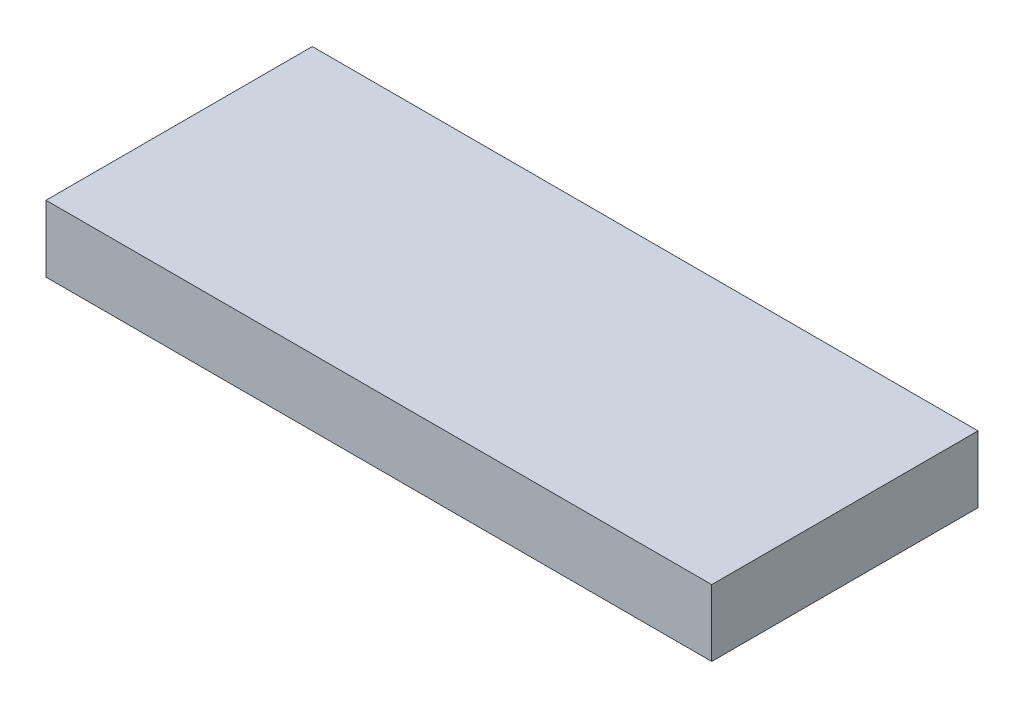
ISO-10303-21;
HEADER;
FILE_DESCRIPTION(('STEP AP214'),'2;1');
FILE_NAME('part.step','',(''),(''),'','','');
FILE_SCHEMA(('AUTOMOTIVE_DESIGN { 1 0 10303 214 1 1 1 1 }'));
ENDSEC;
DATA;
#1=APPLICATION_CONTEXT('core data for automotive mechanical design processes');
#2=APPLICATION_PROTOCOL_DEFINITION('international standard','automotive_design',2000,#1);
#3=PRODUCT_CONTEXT('',#1,'mechanical');
#4=PRODUCT('Part','Part','',(#3));
#5=PRODUCT_RELATED_PRODUCT_CATEGORY('part','',(#4));
#6=PRODUCT_DEFINITION_FORMATION('','',#4);
#7=PRODUCT_DEFINITION_CONTEXT('part definition',#1,'design');
#8=PRODUCT_DEFINITION('design','',#6,#7);
#9=PRODUCT_DEFINITION_SHAPE('','',#8);
#10=(LENGTH_UNIT() NAMED_UNIT(*) SI_UNIT(.MILLI.,.METRE.));
#11=(NAMED_UNIT(*) PLANE_ANGLE_UNIT() SI_UNIT($,.RADIAN.));
#12=(NAMED_UNIT(*) SI_UNIT($,.STERADIAN.) SOLID_ANGLE_UNIT());
#13=UNCERTAINTY_MEASURE_WITH_UNIT(LENGTH_MEASURE(1.E-05),#10,'distance_accuracy_value','');
#14=(GEOMETRIC_REPRESENTATION_CONTEXT(3) GLOBAL_UNCERTAINTY_ASSIGNED_CONTEXT((#13)) GLOBAL_UNIT_ASSIGNED_CONTEXT((#10,
#11,#12)) REPRESENTATION_CONTEXT('',''));
#15=CARTESIAN_POINT('',(0.,0.,0.));
#16=DIRECTION('',(0.,0.,1.));
#17=DIRECTION('',(1.,0.,0.));
#18=AXIS2_PLACEMENT_3D('',#15,#16,#17);
#19=CARTESIAN_POINT('',(152.4,25.4,50.8));
#20=DIRECTION('',(-1.,0.,0.));
#21=DIRECTION('',(0.,0.,1.));
#22=AXIS2_PLACEMENT_3D('',#19,#20,#21);
#23=PLANE('',#22);
#24=DIRECTION('',(0.,0.,-1.));
#25=VECTOR('',#24,1.);
#26=CARTESIAN_POINT('',(152.4,0.,50.8));
#27=LINE('',#26,#25);
#28=CARTESIAN_POINT('',(152.4,0.,50.8));
#29=VERTEX_POINT('',#28);
#30=CARTESIAN_POINT('',(152.4,0.,-50.8));
#31=VERTEX_POINT('',#30);
#32=EDGE_CURVE('E88',#29,#31,#27,.T.);
#33=ORIENTED_EDGE('',*,*,#32,.T.);
#34=DIRECTION('',(0.,-1.,0.));
#35=VECTOR('',#34,1.);
#36=CARTESIAN_POINT('',(152.4,25.4,-50.8));
#37=LINE('',#36,#35);
#38=CARTESIAN_POINT('',(152.4,25.4,-50.8));
#39=VERTEX_POINT('',#38);
#40=EDGE_CURVE('E11',#39,#31,#37,.T.);
#41=ORIENTED_EDGE('',*,*,#40,.F.);
#42=DIRECTION('',(0.,0.,-1.));
#43=VECTOR('',#42,1.);
#44=CARTESIAN_POINT('',(152.4,25.4,50.8));
#45=LINE('',#44,#43);
#46=CARTESIAN_POINT('',(152.4,25.4,50.8));
#47=VERTEX_POINT('',#46);
#48=EDGE_CURVE('E82',#47,#39,#45,.T.);
#49=ORIENTED_EDGE('',*,*,#48,.F.);
#50=DIRECTION('',(0.,-1.,0.));
#51=VECTOR('',#50,1.);
#52=CARTESIAN_POINT('',(152.4,25.4,50.8));
#53=LINE('',#52,#51);
#54=EDGE_CURVE('E43',#47,#29,#53,.T.);
#55=ORIENTED_EDGE('',*,*,#54,.T.);
#56=EDGE_LOOP('',(#33,#41,#49,#55));
#57=FACE_BOUND('',#56,.T.);
#58=ADVANCED_FACE('F36',(#57),#23,.F.);
#59=CARTESIAN_POINT('',(-152.4,25.4,-50.8));
#60=DIRECTION('',(0.,0.,1.));
#61=DIRECTION('',(1.,0.,0.));
#62=AXIS2_PLACEMENT_3D('',#59,#60,#61);
#63=PLANE('',#62);
#64=DIRECTION('',(-1.,0.,0.));
#65=VECTOR('',#64,1.);
#66=CARTESIAN_POINT('',(-152.4,0.,-50.8));
#67=LINE('',#66,#65);
#68=CARTESIAN_POINT('',(-101.6,0.,-50.8));
#69=VERTEX_POINT('',#68);
#70=EDGE_CURVE('E83',#31,#69,#67,.T.);
#71=ORIENTED_EDGE('',*,*,#70,.T.);
#72=DIRECTION('',(0.,1.,0.));
#73=VECTOR('',#72,1.);
#74=CARTESIAN_POINT('',(-101.6,-113.592253256989,-50.8));
#75=LINE('',#74,#73);
#76=CARTESIAN_POINT('',(-101.6,25.4,-50.8));
#77=VERTEX_POINT('',#76);
#78=EDGE_CURVE('E50',#69,#77,#75,.T.);
#79=ORIENTED_EDGE('',*,*,#78,.T.);
#80=DIRECTION('',(-1.,0.,0.));
#81=VECTOR('',#80,1.);
#82=CARTESIAN_POINT('',(-152.4,25.4,-50.8));
#83=LINE('',#82,#81);
#84=EDGE_CURVE('E97',#39,#77,#83,.T.);
#85=ORIENTED_EDGE('',*,*,#84,.F.);
#86=ORIENTED_EDGE('',*,*,#40,.T.);
#87=EDGE_LOOP('',(#71,#79,#85,#86));
#88=FACE_BOUND('',#87,.T.);
#89=ADVANCED_FACE('F108',(#88),#63,.F.);
#90=CARTESIAN_POINT('',(-152.4,25.4,50.8));
#91=DIRECTION('',(0.,0.,-1.));
#92=DIRECTION('',(-1.,0.,0.));
#93=AXIS2_PLACEMENT_3D('',#90,#91,#92);
#94=PLANE('',#93);
#95=DIRECTION('',(1.,0.,0.));
#96=VECTOR('',#95,1.);
#97=CARTESIAN_POINT('',(-152.4,25.4,50.8));
#98=LINE('',#97,#96);
#99=CARTESIAN_POINT('',(-101.6,25.4,50.8));
#100=VERTEX_POINT('',#99);
#101=EDGE_CURVE('E59',#100,#47,#98,.T.);
#102=ORIENTED_EDGE('',*,*,#101,.F.);
#103=DIRECTION('',(0.,1.,0.));
#104=VECTOR('',#103,1.);
#105=CARTESIAN_POINT('',(-101.6,-113.592253256989,50.8));
#106=LINE('',#105,#104);
#107=CARTESIAN_POINT('',(-101.6,0.,50.8));
#108=VERTEX_POINT('',#107);
#109=EDGE_CURVE('E79',#108,#100,#106,.T.);
#110=ORIENTED_EDGE('',*,*,#109,.F.);
#111=DIRECTION('',(1.,0.,0.));
#112=VECTOR('',#111,1.);
#113=CARTESIAN_POINT('',(-152.4,0.,50.8));
#114=LINE('',#113,#112);
#115=EDGE_CURVE('E73',#108,#29,#114,.T.);
#116=ORIENTED_EDGE('',*,*,#115,.T.);
#117=ORIENTED_EDGE('',*,*,#54,.F.);
#118=EDGE_LOOP('',(#102,#110,#116,#117));
#119=FACE_BOUND('',#118,.T.);
#120=ADVANCED_FACE('F75',(#119),#94,.F.);
#121=CARTESIAN_POINT('',(0.,25.4,0.));
#122=DIRECTION('',(0.,-1.,0.));
#123=DIRECTION('',(0.,0.,-1.));
#124=AXIS2_PLACEMENT_3D('',#121,#122,#123);
#125=PLANE('',#124);
#126=ORIENTED_EDGE('',*,*,#84,.T.);
#127=DIRECTION('',(0.,0.,-1.));
#128=VECTOR('',#127,1.);
#129=CARTESIAN_POINT('',(-101.6,25.4,50.8));
#130=LINE('',#129,#128);
#131=EDGE_CURVE('E101',#100,#77,#130,.T.);
#132=ORIENTED_EDGE('',*,*,#131,.F.);
#133=ORIENTED_EDGE('',*,*,#101,.T.);
#134=ORIENTED_EDGE('',*,*,#48,.T.);
#135=EDGE_LOOP('',(#126,#132,#133,#134));
#136=FACE_BOUND('',#135,.T.);
#137=ADVANCED_FACE('F109',(#136),#125,.F.);
#138=CARTESIAN_POINT('',(0.,0.,0.));
#139=DIRECTION('',(0.,-1.,0.));
#140=DIRECTION('',(0.,0.,-1.));
#141=AXIS2_PLACEMENT_3D('',#138,#139,#140);
#142=PLANE('',#141);
#143=DIRECTION('',(0.,0.,-1.));
#144=VECTOR('',#143,1.);
#145=CARTESIAN_POINT('',(-101.6,0.,50.8));
#146=LINE('',#145,#144);
#147=EDGE_CURVE('E93',#108,#69,#146,.T.);
#148=ORIENTED_EDGE('',*,*,#147,.T.);
#149=ORIENTED_EDGE('',*,*,#70,.F.);
#150=ORIENTED_EDGE('',*,*,#32,.F.);
#151=ORIENTED_EDGE('',*,*,#115,.F.);
#152=EDGE_LOOP('',(#148,#149,#150,#151));
#153=FACE_BOUND('',#152,.T.);
#154=ADVANCED_FACE('F89',(#153),#142,.T.);
#155=CARTESIAN_POINT('',(-101.6,-113.592253256989,50.8));
#156=DIRECTION('',(1.,0.,0.));
#157=DIRECTION('',(0.,0.,-1.));
#158=AXIS2_PLACEMENT_3D('',#155,#156,#157);
#159=PLANE('',#158);
#160=ORIENTED_EDGE('',*,*,#109,.T.);
#161=ORIENTED_EDGE('',*,*,#131,.T.);
#162=ORIENTED_EDGE('',*,*,#78,.F.);
#163=ORIENTED_EDGE('',*,*,#147,.F.);
#164=EDGE_LOOP('',(#160,#161,#162,#163));
#165=FACE_BOUND('',#164,.T.);
#166=ADVANCED_FACE('F104',(#165),#159,.F.);
#167=CLOSED_SHELL('',(#58,#89,#120,#137,#154,#166));
#168=MANIFOLD_SOLID_BREP('B2',#167);
#169=ADVANCED_BREP_SHAPE_REPRESENTATION('',(#18,#168),#14);
#170=SHAPE_DEFINITION_REPRESENTATION(#9,#169);
ENDSEC;
END-ISO-10303-21;
